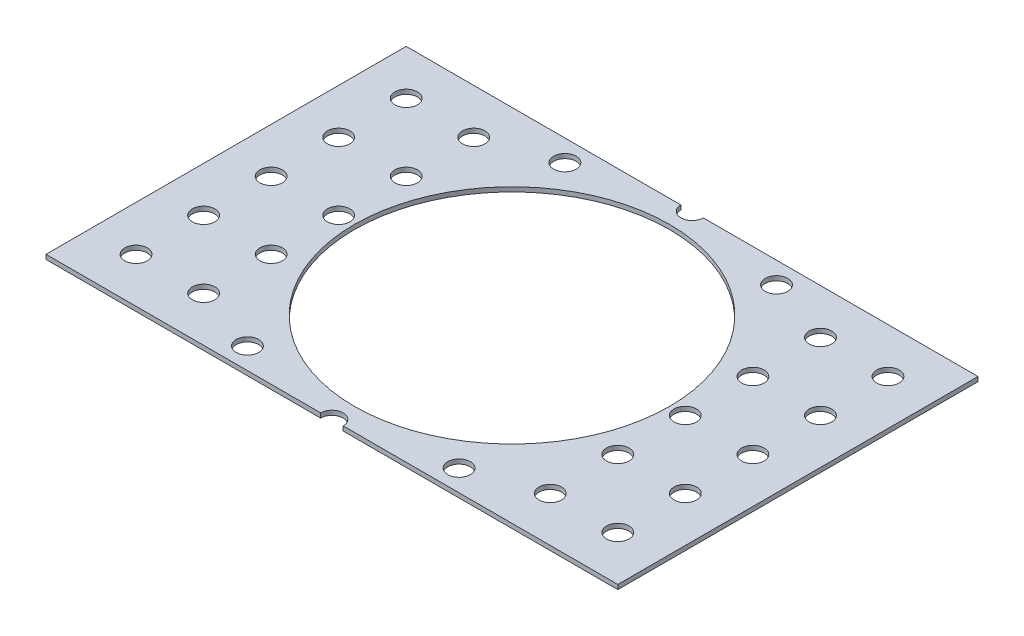
ISO-10303-21;
HEADER;
FILE_DESCRIPTION(('STEP AP214'),'2;1');
FILE_NAME('part.step','',(''),(''),'','','');
FILE_SCHEMA(('AUTOMOTIVE_DESIGN { 1 0 10303 214 1 1 1 1 }'));
ENDSEC;
DATA;
#1=APPLICATION_CONTEXT('core data for automotive mechanical design processes');
#2=APPLICATION_PROTOCOL_DEFINITION('international standard','automotive_design',2000,#1);
#3=PRODUCT_CONTEXT('',#1,'mechanical');
#4=PRODUCT('Part','Part','',(#3));
#5=PRODUCT_RELATED_PRODUCT_CATEGORY('part','',(#4));
#6=PRODUCT_DEFINITION_FORMATION('','',#4);
#7=PRODUCT_DEFINITION_CONTEXT('part definition',#1,'design');
#8=PRODUCT_DEFINITION('design','',#6,#7);
#9=PRODUCT_DEFINITION_SHAPE('','',#8);
#10=(LENGTH_UNIT() NAMED_UNIT(*) SI_UNIT(.MILLI.,.METRE.));
#11=(NAMED_UNIT(*) PLANE_ANGLE_UNIT() SI_UNIT($,.RADIAN.));
#12=(NAMED_UNIT(*) SI_UNIT($,.STERADIAN.) SOLID_ANGLE_UNIT());
#13=UNCERTAINTY_MEASURE_WITH_UNIT(LENGTH_MEASURE(1.E-05),#10,'distance_accuracy_value','');
#14=(GEOMETRIC_REPRESENTATION_CONTEXT(3) GLOBAL_UNCERTAINTY_ASSIGNED_CONTEXT((#13)) GLOBAL_UNIT_ASSIGNED_CONTEXT((#10,
#11,#12)) REPRESENTATION_CONTEXT('',''));
#15=CARTESIAN_POINT('',(0.,0.,0.));
#16=DIRECTION('',(0.,0.,1.));
#17=DIRECTION('',(1.,0.,0.));
#18=AXIS2_PLACEMENT_3D('',#15,#16,#17);
#19=CARTESIAN_POINT('',(-2.5828170556976,1.,55.));
#20=DIRECTION('',(0.,-1.,0.));
#21=DIRECTION('',(0.,0.,-1.));
#22=AXIS2_PLACEMENT_3D('',#19,#20,#21);
#23=PLANE('',#22);
#24=CARTESIAN_POINT('',(35.9171829443024,1.,45.));
#25=DIRECTION('',(0.,1.,0.));
#26=DIRECTION('',(0.,0.,1.));
#27=AXIS2_PLACEMENT_3D('',#24,#25,#26);
#28=CIRCLE('',#27,2.5);
#29=CARTESIAN_POINT('',(35.9171829443024,1.,47.5));
#30=VERTEX_POINT('',#29);
#31=EDGE_CURVE('E314',#30,#30,#28,.T.);
#32=ORIENTED_EDGE('',*,*,#31,.F.);
#33=EDGE_LOOP('',(#32));
#34=FACE_BOUND('',#33,.T.);
#35=CARTESIAN_POINT('',(50.9171829443024,1.,30.));
#36=DIRECTION('',(0.,1.,0.));
#37=DIRECTION('',(0.,0.,1.));
#38=AXIS2_PLACEMENT_3D('',#35,#36,#37);
#39=CIRCLE('',#38,2.49999999999999);
#40=CARTESIAN_POINT('',(50.9171829443024,1.,32.5));
#41=VERTEX_POINT('',#40);
#42=EDGE_CURVE('E302',#41,#41,#39,.T.);
#43=ORIENTED_EDGE('',*,*,#42,.F.);
#44=EDGE_LOOP('',(#43));
#45=FACE_BOUND('',#44,.T.);
#46=CARTESIAN_POINT('',(-56.0828170556976,1.,45.));
#47=DIRECTION('',(0.,1.,0.));
#48=DIRECTION('',(0.,0.,-1.));
#49=AXIS2_PLACEMENT_3D('',#46,#47,#48);
#50=CIRCLE('',#49,2.5);
#51=CARTESIAN_POINT('',(-56.0828170556976,1.,42.5));
#52=VERTEX_POINT('',#51);
#53=EDGE_CURVE('E290',#52,#52,#50,.T.);
#54=ORIENTED_EDGE('',*,*,#53,.F.);
#55=EDGE_LOOP('',(#54));
#56=FACE_BOUND('',#55,.T.);
#57=CARTESIAN_POINT('',(-41.0828170556976,1.,30.));
#58=DIRECTION('',(0.,1.,0.));
#59=DIRECTION('',(0.,0.,-1.));
#60=AXIS2_PLACEMENT_3D('',#57,#58,#59);
#61=CIRCLE('',#60,2.5);
#62=CARTESIAN_POINT('',(-41.0828170556976,1.,27.5));
#63=VERTEX_POINT('',#62);
#64=EDGE_CURVE('E278',#63,#63,#61,.T.);
#65=ORIENTED_EDGE('',*,*,#64,.F.);
#66=EDGE_LOOP('',(#65));
#67=FACE_BOUND('',#66,.T.);
#68=CARTESIAN_POINT('',(-26.0828170556976,1.,50.2528935744086));
#69=DIRECTION('',(0.,1.,0.));
#70=DIRECTION('',(0.,0.,-1.));
#71=AXIS2_PLACEMENT_3D('',#68,#69,#70);
#72=CIRCLE('',#71,2.5);
#73=CARTESIAN_POINT('',(-26.0828170556976,1.,47.7528935744086));
#74=VERTEX_POINT('',#73);
#75=EDGE_CURVE('E266',#74,#74,#72,.T.);
#76=ORIENTED_EDGE('',*,*,#75,.F.);
#77=EDGE_LOOP('',(#76));
#78=FACE_BOUND('',#77,.T.);
#79=CARTESIAN_POINT('',(35.9171829443024,1.,-15.));
#80=DIRECTION('',(0.,1.,0.));
#81=DIRECTION('',(0.,0.,-1.));
#82=AXIS2_PLACEMENT_3D('',#79,#80,#81);
#83=CIRCLE('',#82,2.50000000000002);
#84=CARTESIAN_POINT('',(35.9171829443024,1.,-17.5));
#85=VERTEX_POINT('',#84);
#86=EDGE_CURVE('E254',#85,#85,#83,.T.);
#87=ORIENTED_EDGE('',*,*,#86,.F.);
#88=EDGE_LOOP('',(#87));
#89=FACE_BOUND('',#88,.T.);
#90=CARTESIAN_POINT('',(35.9171829443024,1.,15.));
#91=DIRECTION('',(0.,1.,0.));
#92=DIRECTION('',(0.,0.,-1.));
#93=AXIS2_PLACEMENT_3D('',#90,#91,#92);
#94=CIRCLE('',#93,2.50000000000002);
#95=CARTESIAN_POINT('',(35.9171829443024,1.,12.5));
#96=VERTEX_POINT('',#95);
#97=EDGE_CURVE('E242',#96,#96,#94,.T.);
#98=ORIENTED_EDGE('',*,*,#97,.F.);
#99=EDGE_LOOP('',(#98));
#100=FACE_BOUND('',#99,.T.);
#101=CARTESIAN_POINT('',(50.9171829443024,1.,0.));
#102=DIRECTION('',(0.,1.,0.));
#103=DIRECTION('',(0.,0.,-1.));
#104=AXIS2_PLACEMENT_3D('',#101,#102,#103);
#105=CIRCLE('',#104,2.50000000000002);
#106=CARTESIAN_POINT('',(50.9171829443024,1.,-2.50000000000002));
#107=VERTEX_POINT('',#106);
#108=EDGE_CURVE('E230',#107,#107,#105,.T.);
#109=ORIENTED_EDGE('',*,*,#108,.F.);
#110=EDGE_LOOP('',(#109));
#111=FACE_BOUND('',#110,.T.);
#112=CARTESIAN_POINT('',(-41.0828170556976,1.,15.));
#113=DIRECTION('',(0.,1.,0.));
#114=DIRECTION('',(0.,0.,1.));
#115=AXIS2_PLACEMENT_3D('',#112,#113,#114);
#116=CIRCLE('',#115,2.5);
#117=CARTESIAN_POINT('',(-41.0828170556976,1.,17.5));
#118=VERTEX_POINT('',#117);
#119=EDGE_CURVE('E218',#118,#118,#116,.T.);
#120=ORIENTED_EDGE('',*,*,#119,.F.);
#121=EDGE_LOOP('',(#120));
#122=FACE_BOUND('',#121,.T.);
#123=CARTESIAN_POINT('',(-26.0828170556976,1.,-20.2528935744086));
#124=DIRECTION('',(0.,1.,0.));
#125=DIRECTION('',(0.,0.,1.));
#126=AXIS2_PLACEMENT_3D('',#123,#124,#125);
#127=CIRCLE('',#126,2.5);
#128=CARTESIAN_POINT('',(-26.0828170556976,1.,-17.7528935744086));
#129=VERTEX_POINT('',#128);
#130=EDGE_CURVE('E206',#129,#129,#127,.T.);
#131=ORIENTED_EDGE('',*,*,#130,.F.);
#132=EDGE_LOOP('',(#131));
#133=FACE_BOUND('',#132,.T.);
#134=CARTESIAN_POINT('',(-56.0828170556976,1.,0.));
#135=DIRECTION('',(0.,1.,0.));
#136=DIRECTION('',(0.,0.,1.));
#137=AXIS2_PLACEMENT_3D('',#134,#135,#136);
#138=CIRCLE('',#137,2.5);
#139=CARTESIAN_POINT('',(-56.0828170556976,1.,2.5));
#140=VERTEX_POINT('',#139);
#141=EDGE_CURVE('E194',#140,#140,#138,.T.);
#142=ORIENTED_EDGE('',*,*,#141,.F.);
#143=EDGE_LOOP('',(#142));
#144=FACE_BOUND('',#143,.T.);
#145=CARTESIAN_POINT('',(-56.0828170556976,1.,-15.));
#146=DIRECTION('',(0.,1.,0.));
#147=DIRECTION('',(0.,0.,1.));
#148=AXIS2_PLACEMENT_3D('',#145,#146,#147);
#149=CIRCLE('',#148,2.5);
#150=CARTESIAN_POINT('',(-56.0828170556976,1.,-12.5));
#151=VERTEX_POINT('',#150);
#152=EDGE_CURVE('E182',#151,#151,#149,.T.);
#153=ORIENTED_EDGE('',*,*,#152,.F.);
#154=EDGE_LOOP('',(#153));
#155=FACE_BOUND('',#154,.T.);
#156=DIRECTION('',(0.,0.,1.));
#157=VECTOR('',#156,1.);
#158=CARTESIAN_POINT('',(-66.0828170556976,1.,-25.));
#159=LINE('',#158,#157);
#160=CARTESIAN_POINT('',(-66.0828170556976,1.,-25.));
#161=VERTEX_POINT('',#160);
#162=CARTESIAN_POINT('',(-66.0828170556976,1.,55.));
#163=VERTEX_POINT('',#162);
#164=EDGE_CURVE('E145',#161,#163,#159,.T.);
#165=ORIENTED_EDGE('',*,*,#164,.T.);
#166=DIRECTION('',(1.,0.,0.));
#167=VECTOR('',#166,1.);
#168=CARTESIAN_POINT('',(-66.0828170556976,1.,55.));
#169=LINE('',#168,#167);
#170=CARTESIAN_POINT('',(-5.0828170556976,1.,55.));
#171=VERTEX_POINT('',#170);
#172=EDGE_CURVE('E93',#163,#171,#169,.T.);
#173=ORIENTED_EDGE('',*,*,#172,.T.);
#174=CARTESIAN_POINT('',(-2.5828170556976,1.,55.));
#175=DIRECTION('',(0.,-1.,0.));
#176=DIRECTION('',(0.,0.,-1.));
#177=AXIS2_PLACEMENT_3D('',#174,#175,#176);
#178=CIRCLE('',#177,2.5);
#179=CARTESIAN_POINT('',(-0.0828170556975965,1.,55.));
#180=VERTEX_POINT('',#179);
#181=EDGE_CURVE('E160',#171,#180,#178,.T.);
#182=ORIENTED_EDGE('',*,*,#181,.T.);
#183=DIRECTION('',(1.,0.,0.));
#184=VECTOR('',#183,1.);
#185=CARTESIAN_POINT('',(-0.0828170556975965,1.,55.));
#186=LINE('',#185,#184);
#187=CARTESIAN_POINT('',(60.9171829443024,1.,55.));
#188=VERTEX_POINT('',#187);
#189=EDGE_CURVE('E173',#180,#188,#186,.T.);
#190=ORIENTED_EDGE('',*,*,#189,.T.);
#191=DIRECTION('',(0.,0.,-1.));
#192=VECTOR('',#191,1.);
#193=CARTESIAN_POINT('',(60.9171829443024,1.,-25.));
#194=LINE('',#193,#192);
#195=CARTESIAN_POINT('',(60.9171829443024,1.,-25.));
#196=VERTEX_POINT('',#195);
#197=EDGE_CURVE('E112',#188,#196,#194,.T.);
#198=ORIENTED_EDGE('',*,*,#197,.T.);
#199=DIRECTION('',(-1.,0.,0.));
#200=VECTOR('',#199,1.);
#201=CARTESIAN_POINT('',(-0.082817055697593,1.,-25.));
#202=LINE('',#201,#200);
#203=CARTESIAN_POINT('',(-0.082817055697593,1.,-25.));
#204=VERTEX_POINT('',#203);
#205=EDGE_CURVE('E106',#196,#204,#202,.T.);
#206=ORIENTED_EDGE('',*,*,#205,.T.);
#207=CARTESIAN_POINT('',(-2.5828170556976,1.,-25.0208637163013));
#208=DIRECTION('',(0.,-1.,0.));
#209=DIRECTION('',(0.,0.,1.));
#210=AXIS2_PLACEMENT_3D('',#207,#208,#209);
#211=CIRCLE('',#210,2.50008705741579);
#212=CARTESIAN_POINT('',(-5.08281705569761,1.,-25.));
#213=VERTEX_POINT('',#212);
#214=EDGE_CURVE('E110',#204,#213,#211,.T.);
#215=ORIENTED_EDGE('',*,*,#214,.T.);
#216=DIRECTION('',(-1.,0.,0.));
#217=VECTOR('',#216,1.);
#218=CARTESIAN_POINT('',(-66.0828170556976,1.,-25.));
#219=LINE('',#218,#217);
#220=EDGE_CURVE('E50',#213,#161,#219,.T.);
#221=ORIENTED_EDGE('',*,*,#220,.T.);
#222=EDGE_LOOP('',(#165,#173,#182,#190,#198,#206,#215,#221));
#223=FACE_BOUND('',#222,.T.);
#224=CARTESIAN_POINT('',(-2.5828170556976,1.,15.));
#225=DIRECTION('',(0.,1.,0.));
#226=DIRECTION('',(0.,0.,1.));
#227=AXIS2_PLACEMENT_3D('',#224,#225,#226);
#228=CIRCLE('',#227,35.);
#229=CARTESIAN_POINT('',(-2.5828170556976,1.,50.));
#230=VERTEX_POINT('',#229);
#231=EDGE_CURVE('E134',#230,#230,#228,.T.);
#232=ORIENTED_EDGE('',*,*,#231,.F.);
#233=EDGE_LOOP('',(#232));
#234=FACE_BOUND('',#233,.T.);
#235=CARTESIAN_POINT('',(-41.0828170556976,1.,-15.));
#236=DIRECTION('',(0.,1.,0.));
#237=DIRECTION('',(0.,0.,1.));
#238=AXIS2_PLACEMENT_3D('',#235,#236,#237);
#239=CIRCLE('',#238,2.5);
#240=CARTESIAN_POINT('',(-41.0828170556976,1.,-12.5));
#241=VERTEX_POINT('',#240);
#242=EDGE_CURVE('E188',#241,#241,#239,.T.);
#243=ORIENTED_EDGE('',*,*,#242,.F.);
#244=EDGE_LOOP('',(#243));
#245=FACE_BOUND('',#244,.T.);
#246=CARTESIAN_POINT('',(-41.0828170556976,1.,0.));
#247=DIRECTION('',(0.,1.,0.));
#248=DIRECTION('',(0.,0.,1.));
#249=AXIS2_PLACEMENT_3D('',#246,#247,#248);
#250=CIRCLE('',#249,2.5);
#251=CARTESIAN_POINT('',(-41.0828170556976,1.,2.5));
#252=VERTEX_POINT('',#251);
#253=EDGE_CURVE('E200',#252,#252,#250,.T.);
#254=ORIENTED_EDGE('',*,*,#253,.F.);
#255=EDGE_LOOP('',(#254));
#256=FACE_BOUND('',#255,.T.);
#257=CARTESIAN_POINT('',(-56.0828170556976,1.,15.));
#258=DIRECTION('',(0.,1.,0.));
#259=DIRECTION('',(0.,0.,1.));
#260=AXIS2_PLACEMENT_3D('',#257,#258,#259);
#261=CIRCLE('',#260,2.5);
#262=CARTESIAN_POINT('',(-56.0828170556976,1.,17.5));
#263=VERTEX_POINT('',#262);
#264=EDGE_CURVE('E212',#263,#263,#261,.T.);
#265=ORIENTED_EDGE('',*,*,#264,.F.);
#266=EDGE_LOOP('',(#265));
#267=FACE_BOUND('',#266,.T.);
#268=CARTESIAN_POINT('',(50.9171829443024,1.,-15.));
#269=DIRECTION('',(0.,1.,0.));
#270=DIRECTION('',(0.,0.,-1.));
#271=AXIS2_PLACEMENT_3D('',#268,#269,#270);
#272=CIRCLE('',#271,2.50000000000002);
#273=CARTESIAN_POINT('',(50.9171829443024,1.,-17.5));
#274=VERTEX_POINT('',#273);
#275=EDGE_CURVE('E224',#274,#274,#272,.T.);
#276=ORIENTED_EDGE('',*,*,#275,.F.);
#277=EDGE_LOOP('',(#276));
#278=FACE_BOUND('',#277,.T.);
#279=CARTESIAN_POINT('',(50.9171829443024,1.,15.));
#280=DIRECTION('',(0.,1.,0.));
#281=DIRECTION('',(0.,0.,-1.));
#282=AXIS2_PLACEMENT_3D('',#279,#280,#281);
#283=CIRCLE('',#282,2.50000000000002);
#284=CARTESIAN_POINT('',(50.9171829443024,1.,12.5));
#285=VERTEX_POINT('',#284);
#286=EDGE_CURVE('E236',#285,#285,#283,.T.);
#287=ORIENTED_EDGE('',*,*,#286,.F.);
#288=EDGE_LOOP('',(#287));
#289=FACE_BOUND('',#288,.T.);
#290=CARTESIAN_POINT('',(35.9171829443024,1.,0.));
#291=DIRECTION('',(0.,1.,0.));
#292=DIRECTION('',(0.,0.,-1.));
#293=AXIS2_PLACEMENT_3D('',#290,#291,#292);
#294=CIRCLE('',#293,2.50000000000002);
#295=CARTESIAN_POINT('',(35.9171829443024,1.,-2.50000000000002));
#296=VERTEX_POINT('',#295);
#297=EDGE_CURVE('E248',#296,#296,#294,.T.);
#298=ORIENTED_EDGE('',*,*,#297,.F.);
#299=EDGE_LOOP('',(#298));
#300=FACE_BOUND('',#299,.T.);
#301=CARTESIAN_POINT('',(20.9171829443024,1.,-20.2528935744086));
#302=DIRECTION('',(0.,1.,0.));
#303=DIRECTION('',(0.,0.,-1.));
#304=AXIS2_PLACEMENT_3D('',#301,#302,#303);
#305=CIRCLE('',#304,2.50000000000001);
#306=CARTESIAN_POINT('',(20.9171829443024,1.,-22.7528935744086));
#307=VERTEX_POINT('',#306);
#308=EDGE_CURVE('E260',#307,#307,#305,.T.);
#309=ORIENTED_EDGE('',*,*,#308,.F.);
#310=EDGE_LOOP('',(#309));
#311=FACE_BOUND('',#310,.T.);
#312=CARTESIAN_POINT('',(-41.0828170556976,1.,45.));
#313=DIRECTION('',(0.,1.,0.));
#314=DIRECTION('',(0.,0.,-1.));
#315=AXIS2_PLACEMENT_3D('',#312,#313,#314);
#316=CIRCLE('',#315,2.5);
#317=CARTESIAN_POINT('',(-41.0828170556976,1.,42.5));
#318=VERTEX_POINT('',#317);
#319=EDGE_CURVE('E272',#318,#318,#316,.T.);
#320=ORIENTED_EDGE('',*,*,#319,.F.);
#321=EDGE_LOOP('',(#320));
#322=FACE_BOUND('',#321,.T.);
#323=CARTESIAN_POINT('',(-56.0828170556976,1.,30.));
#324=DIRECTION('',(0.,1.,0.));
#325=DIRECTION('',(0.,0.,-1.));
#326=AXIS2_PLACEMENT_3D('',#323,#324,#325);
#327=CIRCLE('',#326,2.49999999999999);
#328=CARTESIAN_POINT('',(-56.0828170556976,1.,27.5));
#329=VERTEX_POINT('',#328);
#330=EDGE_CURVE('E284',#329,#329,#327,.T.);
#331=ORIENTED_EDGE('',*,*,#330,.F.);
#332=EDGE_LOOP('',(#331));
#333=FACE_BOUND('',#332,.T.);
#334=CARTESIAN_POINT('',(50.9171829443024,1.,45.));
#335=DIRECTION('',(0.,1.,0.));
#336=DIRECTION('',(0.,0.,1.));
#337=AXIS2_PLACEMENT_3D('',#334,#335,#336);
#338=CIRCLE('',#337,2.5);
#339=CARTESIAN_POINT('',(50.9171829443024,1.,47.5));
#340=VERTEX_POINT('',#339);
#341=EDGE_CURVE('E296',#340,#340,#338,.T.);
#342=ORIENTED_EDGE('',*,*,#341,.F.);
#343=EDGE_LOOP('',(#342));
#344=FACE_BOUND('',#343,.T.);
#345=CARTESIAN_POINT('',(35.9171829443024,1.,30.));
#346=DIRECTION('',(0.,1.,0.));
#347=DIRECTION('',(0.,0.,1.));
#348=AXIS2_PLACEMENT_3D('',#345,#346,#347);
#349=CIRCLE('',#348,2.5);
#350=CARTESIAN_POINT('',(35.9171829443024,1.,32.5));
#351=VERTEX_POINT('',#350);
#352=EDGE_CURVE('E308',#351,#351,#349,.T.);
#353=ORIENTED_EDGE('',*,*,#352,.F.);
#354=EDGE_LOOP('',(#353));
#355=FACE_BOUND('',#354,.T.);
#356=CARTESIAN_POINT('',(20.9171829443024,1.,50.2528935744086));
#357=DIRECTION('',(0.,1.,0.));
#358=DIRECTION('',(0.,0.,1.));
#359=AXIS2_PLACEMENT_3D('',#356,#357,#358);
#360=CIRCLE('',#359,2.5);
#361=CARTESIAN_POINT('',(20.9171829443024,1.,52.7528935744086));
#362=VERTEX_POINT('',#361);
#363=EDGE_CURVE('E320',#362,#362,#360,.T.);
#364=ORIENTED_EDGE('',*,*,#363,.F.);
#365=EDGE_LOOP('',(#364));
#366=FACE_BOUND('',#365,.T.);
#367=ADVANCED_FACE('F33',(#34,#45,#56,#67,#78,#89,#100,#111,#122,#133,#144,#155,#223,#234,#245,
#256,#267,#278,#289,#300,#311,#322,#333,#344,#355,#366),#23,.F.);
#368=CARTESIAN_POINT('',(-2.5828170556976,0.,55.));
#369=DIRECTION('',(0.,-1.,0.));
#370=DIRECTION('',(0.,0.,-1.));
#371=AXIS2_PLACEMENT_3D('',#368,#369,#370);
#372=PLANE('',#371);
#373=CARTESIAN_POINT('',(35.9171829443024,0.,45.));
#374=DIRECTION('',(0.,1.,0.));
#375=DIRECTION('',(0.,0.,1.));
#376=AXIS2_PLACEMENT_3D('',#373,#374,#375);
#377=CIRCLE('',#376,2.5);
#378=CARTESIAN_POINT('',(35.9171829443024,0.,47.5));
#379=VERTEX_POINT('',#378);
#380=EDGE_CURVE('E317',#379,#379,#377,.T.);
#381=ORIENTED_EDGE('',*,*,#380,.T.);
#382=EDGE_LOOP('',(#381));
#383=FACE_BOUND('',#382,.T.);
#384=CARTESIAN_POINT('',(50.9171829443024,0.,30.));
#385=DIRECTION('',(0.,1.,0.));
#386=DIRECTION('',(0.,0.,1.));
#387=AXIS2_PLACEMENT_3D('',#384,#385,#386);
#388=CIRCLE('',#387,2.49999999999999);
#389=CARTESIAN_POINT('',(50.9171829443024,0.,32.5));
#390=VERTEX_POINT('',#389);
#391=EDGE_CURVE('E305',#390,#390,#388,.T.);
#392=ORIENTED_EDGE('',*,*,#391,.T.);
#393=EDGE_LOOP('',(#392));
#394=FACE_BOUND('',#393,.T.);
#395=CARTESIAN_POINT('',(-56.0828170556976,0.,45.));
#396=DIRECTION('',(0.,1.,0.));
#397=DIRECTION('',(0.,0.,-1.));
#398=AXIS2_PLACEMENT_3D('',#395,#396,#397);
#399=CIRCLE('',#398,2.5);
#400=CARTESIAN_POINT('',(-56.0828170556976,0.,42.5));
#401=VERTEX_POINT('',#400);
#402=EDGE_CURVE('E293',#401,#401,#399,.T.);
#403=ORIENTED_EDGE('',*,*,#402,.T.);
#404=EDGE_LOOP('',(#403));
#405=FACE_BOUND('',#404,.T.);
#406=CARTESIAN_POINT('',(-41.0828170556976,0.,30.));
#407=DIRECTION('',(0.,1.,0.));
#408=DIRECTION('',(0.,0.,-1.));
#409=AXIS2_PLACEMENT_3D('',#406,#407,#408);
#410=CIRCLE('',#409,2.5);
#411=CARTESIAN_POINT('',(-41.0828170556976,0.,27.5));
#412=VERTEX_POINT('',#411);
#413=EDGE_CURVE('E281',#412,#412,#410,.T.);
#414=ORIENTED_EDGE('',*,*,#413,.T.);
#415=EDGE_LOOP('',(#414));
#416=FACE_BOUND('',#415,.T.);
#417=CARTESIAN_POINT('',(-26.0828170556976,0.,50.2528935744086));
#418=DIRECTION('',(0.,1.,0.));
#419=DIRECTION('',(0.,0.,-1.));
#420=AXIS2_PLACEMENT_3D('',#417,#418,#419);
#421=CIRCLE('',#420,2.5);
#422=CARTESIAN_POINT('',(-26.0828170556976,0.,47.7528935744086));
#423=VERTEX_POINT('',#422);
#424=EDGE_CURVE('E269',#423,#423,#421,.T.);
#425=ORIENTED_EDGE('',*,*,#424,.T.);
#426=EDGE_LOOP('',(#425));
#427=FACE_BOUND('',#426,.T.);
#428=CARTESIAN_POINT('',(35.9171829443024,0.,-15.));
#429=DIRECTION('',(0.,1.,0.));
#430=DIRECTION('',(0.,0.,-1.));
#431=AXIS2_PLACEMENT_3D('',#428,#429,#430);
#432=CIRCLE('',#431,2.50000000000002);
#433=CARTESIAN_POINT('',(35.9171829443024,0.,-17.5));
#434=VERTEX_POINT('',#433);
#435=EDGE_CURVE('E257',#434,#434,#432,.T.);
#436=ORIENTED_EDGE('',*,*,#435,.T.);
#437=EDGE_LOOP('',(#436));
#438=FACE_BOUND('',#437,.T.);
#439=CARTESIAN_POINT('',(35.9171829443024,0.,15.));
#440=DIRECTION('',(0.,1.,0.));
#441=DIRECTION('',(0.,0.,-1.));
#442=AXIS2_PLACEMENT_3D('',#439,#440,#441);
#443=CIRCLE('',#442,2.50000000000002);
#444=CARTESIAN_POINT('',(35.9171829443024,0.,12.5));
#445=VERTEX_POINT('',#444);
#446=EDGE_CURVE('E245',#445,#445,#443,.T.);
#447=ORIENTED_EDGE('',*,*,#446,.T.);
#448=EDGE_LOOP('',(#447));
#449=FACE_BOUND('',#448,.T.);
#450=CARTESIAN_POINT('',(50.9171829443024,0.,0.));
#451=DIRECTION('',(0.,1.,0.));
#452=DIRECTION('',(0.,0.,-1.));
#453=AXIS2_PLACEMENT_3D('',#450,#451,#452);
#454=CIRCLE('',#453,2.50000000000002);
#455=CARTESIAN_POINT('',(50.9171829443024,0.,-2.50000000000002));
#456=VERTEX_POINT('',#455);
#457=EDGE_CURVE('E233',#456,#456,#454,.T.);
#458=ORIENTED_EDGE('',*,*,#457,.T.);
#459=EDGE_LOOP('',(#458));
#460=FACE_BOUND('',#459,.T.);
#461=CARTESIAN_POINT('',(-41.0828170556976,0.,15.));
#462=DIRECTION('',(0.,1.,0.));
#463=DIRECTION('',(0.,0.,1.));
#464=AXIS2_PLACEMENT_3D('',#461,#462,#463);
#465=CIRCLE('',#464,2.5);
#466=CARTESIAN_POINT('',(-41.0828170556976,0.,17.5));
#467=VERTEX_POINT('',#466);
#468=EDGE_CURVE('E221',#467,#467,#465,.T.);
#469=ORIENTED_EDGE('',*,*,#468,.T.);
#470=EDGE_LOOP('',(#469));
#471=FACE_BOUND('',#470,.T.);
#472=CARTESIAN_POINT('',(-26.0828170556976,0.,-20.2528935744086));
#473=DIRECTION('',(0.,1.,0.));
#474=DIRECTION('',(0.,0.,1.));
#475=AXIS2_PLACEMENT_3D('',#472,#473,#474);
#476=CIRCLE('',#475,2.5);
#477=CARTESIAN_POINT('',(-26.0828170556976,0.,-17.7528935744086));
#478=VERTEX_POINT('',#477);
#479=EDGE_CURVE('E209',#478,#478,#476,.T.);
#480=ORIENTED_EDGE('',*,*,#479,.T.);
#481=EDGE_LOOP('',(#480));
#482=FACE_BOUND('',#481,.T.);
#483=CARTESIAN_POINT('',(-56.0828170556976,0.,0.));
#484=DIRECTION('',(0.,1.,0.));
#485=DIRECTION('',(0.,0.,1.));
#486=AXIS2_PLACEMENT_3D('',#483,#484,#485);
#487=CIRCLE('',#486,2.5);
#488=CARTESIAN_POINT('',(-56.0828170556976,0.,2.5));
#489=VERTEX_POINT('',#488);
#490=EDGE_CURVE('E197',#489,#489,#487,.T.);
#491=ORIENTED_EDGE('',*,*,#490,.T.);
#492=EDGE_LOOP('',(#491));
#493=FACE_BOUND('',#492,.T.);
#494=CARTESIAN_POINT('',(-56.0828170556976,0.,-15.));
#495=DIRECTION('',(0.,1.,0.));
#496=DIRECTION('',(0.,0.,1.));
#497=AXIS2_PLACEMENT_3D('',#494,#495,#496);
#498=CIRCLE('',#497,2.5);
#499=CARTESIAN_POINT('',(-56.0828170556976,0.,-12.5));
#500=VERTEX_POINT('',#499);
#501=EDGE_CURVE('E185',#500,#500,#498,.T.);
#502=ORIENTED_EDGE('',*,*,#501,.T.);
#503=EDGE_LOOP('',(#502));
#504=FACE_BOUND('',#503,.T.);
#505=DIRECTION('',(0.,0.,1.));
#506=VECTOR('',#505,1.);
#507=CARTESIAN_POINT('',(-66.0828170556976,0.,-25.));
#508=LINE('',#507,#506);
#509=CARTESIAN_POINT('',(-66.0828170556976,0.,-25.));
#510=VERTEX_POINT('',#509);
#511=CARTESIAN_POINT('',(-66.0828170556976,0.,55.));
#512=VERTEX_POINT('',#511);
#513=EDGE_CURVE('E130',#510,#512,#508,.T.);
#514=ORIENTED_EDGE('',*,*,#513,.F.);
#515=DIRECTION('',(-1.,0.,0.));
#516=VECTOR('',#515,1.);
#517=CARTESIAN_POINT('',(-66.0828170556976,0.,-25.));
#518=LINE('',#517,#516);
#519=CARTESIAN_POINT('',(-5.08281705569761,0.,-25.));
#520=VERTEX_POINT('',#519);
#521=EDGE_CURVE('E85',#520,#510,#518,.T.);
#522=ORIENTED_EDGE('',*,*,#521,.F.);
#523=CARTESIAN_POINT('',(-2.5828170556976,0.,-25.0208637163013));
#524=DIRECTION('',(0.,-1.,0.));
#525=DIRECTION('',(0.,0.,1.));
#526=AXIS2_PLACEMENT_3D('',#523,#524,#525);
#527=CIRCLE('',#526,2.50008705741579);
#528=CARTESIAN_POINT('',(-0.082817055697593,0.,-25.));
#529=VERTEX_POINT('',#528);
#530=EDGE_CURVE('E79',#529,#520,#527,.T.);
#531=ORIENTED_EDGE('',*,*,#530,.F.);
#532=DIRECTION('',(-1.,0.,0.));
#533=VECTOR('',#532,1.);
#534=CARTESIAN_POINT('',(-0.082817055697593,0.,-25.));
#535=LINE('',#534,#533);
#536=CARTESIAN_POINT('',(60.9171829443024,0.,-25.));
#537=VERTEX_POINT('',#536);
#538=EDGE_CURVE('E120',#537,#529,#535,.T.);
#539=ORIENTED_EDGE('',*,*,#538,.F.);
#540=DIRECTION('',(0.,0.,-1.));
#541=VECTOR('',#540,1.);
#542=CARTESIAN_POINT('',(60.9171829443024,0.,-25.));
#543=LINE('',#542,#541);
#544=CARTESIAN_POINT('',(60.9171829443024,0.,55.));
#545=VERTEX_POINT('',#544);
#546=EDGE_CURVE('E140',#545,#537,#543,.T.);
#547=ORIENTED_EDGE('',*,*,#546,.F.);
#548=DIRECTION('',(1.,0.,0.));
#549=VECTOR('',#548,1.);
#550=CARTESIAN_POINT('',(-0.0828170556975965,0.,55.));
#551=LINE('',#550,#549);
#552=CARTESIAN_POINT('',(-0.0828170556975965,0.,55.));
#553=VERTEX_POINT('',#552);
#554=EDGE_CURVE('E138',#553,#545,#551,.T.);
#555=ORIENTED_EDGE('',*,*,#554,.F.);
#556=CARTESIAN_POINT('',(-2.5828170556976,0.,55.));
#557=DIRECTION('',(0.,-1.,0.));
#558=DIRECTION('',(0.,0.,-1.));
#559=AXIS2_PLACEMENT_3D('',#556,#557,#558);
#560=CIRCLE('',#559,2.5);
#561=CARTESIAN_POINT('',(-5.0828170556976,0.,55.));
#562=VERTEX_POINT('',#561);
#563=EDGE_CURVE('E136',#562,#553,#560,.T.);
#564=ORIENTED_EDGE('',*,*,#563,.F.);
#565=DIRECTION('',(1.,0.,0.));
#566=VECTOR('',#565,1.);
#567=CARTESIAN_POINT('',(-66.0828170556976,0.,55.));
#568=LINE('',#567,#566);
#569=EDGE_CURVE('E133',#512,#562,#568,.T.);
#570=ORIENTED_EDGE('',*,*,#569,.F.);
#571=EDGE_LOOP('',(#514,#522,#531,#539,#547,#555,#564,#570));
#572=FACE_BOUND('',#571,.T.);
#573=CARTESIAN_POINT('',(-2.5828170556976,0.,15.));
#574=DIRECTION('',(0.,1.,0.));
#575=DIRECTION('',(0.,0.,1.));
#576=AXIS2_PLACEMENT_3D('',#573,#574,#575);
#577=CIRCLE('',#576,35.);
#578=CARTESIAN_POINT('',(-2.5828170556976,0.,50.));
#579=VERTEX_POINT('',#578);
#580=EDGE_CURVE('E179',#579,#579,#577,.T.);
#581=ORIENTED_EDGE('',*,*,#580,.T.);
#582=EDGE_LOOP('',(#581));
#583=FACE_BOUND('',#582,.T.);
#584=CARTESIAN_POINT('',(-41.0828170556976,0.,-15.));
#585=DIRECTION('',(0.,1.,0.));
#586=DIRECTION('',(0.,0.,1.));
#587=AXIS2_PLACEMENT_3D('',#584,#585,#586);
#588=CIRCLE('',#587,2.5);
#589=CARTESIAN_POINT('',(-41.0828170556976,0.,-12.5));
#590=VERTEX_POINT('',#589);
#591=EDGE_CURVE('E191',#590,#590,#588,.T.);
#592=ORIENTED_EDGE('',*,*,#591,.T.);
#593=EDGE_LOOP('',(#592));
#594=FACE_BOUND('',#593,.T.);
#595=CARTESIAN_POINT('',(-41.0828170556976,0.,0.));
#596=DIRECTION('',(0.,1.,0.));
#597=DIRECTION('',(0.,0.,1.));
#598=AXIS2_PLACEMENT_3D('',#595,#596,#597);
#599=CIRCLE('',#598,2.5);
#600=CARTESIAN_POINT('',(-41.0828170556976,0.,2.5));
#601=VERTEX_POINT('',#600);
#602=EDGE_CURVE('E203',#601,#601,#599,.T.);
#603=ORIENTED_EDGE('',*,*,#602,.T.);
#604=EDGE_LOOP('',(#603));
#605=FACE_BOUND('',#604,.T.);
#606=CARTESIAN_POINT('',(-56.0828170556976,0.,15.));
#607=DIRECTION('',(0.,1.,0.));
#608=DIRECTION('',(0.,0.,1.));
#609=AXIS2_PLACEMENT_3D('',#606,#607,#608);
#610=CIRCLE('',#609,2.5);
#611=CARTESIAN_POINT('',(-56.0828170556976,0.,17.5));
#612=VERTEX_POINT('',#611);
#613=EDGE_CURVE('E215',#612,#612,#610,.T.);
#614=ORIENTED_EDGE('',*,*,#613,.T.);
#615=EDGE_LOOP('',(#614));
#616=FACE_BOUND('',#615,.T.);
#617=CARTESIAN_POINT('',(50.9171829443024,0.,-15.));
#618=DIRECTION('',(0.,1.,0.));
#619=DIRECTION('',(0.,0.,-1.));
#620=AXIS2_PLACEMENT_3D('',#617,#618,#619);
#621=CIRCLE('',#620,2.50000000000002);
#622=CARTESIAN_POINT('',(50.9171829443024,0.,-17.5));
#623=VERTEX_POINT('',#622);
#624=EDGE_CURVE('E227',#623,#623,#621,.T.);
#625=ORIENTED_EDGE('',*,*,#624,.T.);
#626=EDGE_LOOP('',(#625));
#627=FACE_BOUND('',#626,.T.);
#628=CARTESIAN_POINT('',(50.9171829443024,0.,15.));
#629=DIRECTION('',(0.,1.,0.));
#630=DIRECTION('',(0.,0.,-1.));
#631=AXIS2_PLACEMENT_3D('',#628,#629,#630);
#632=CIRCLE('',#631,2.50000000000002);
#633=CARTESIAN_POINT('',(50.9171829443024,0.,12.5));
#634=VERTEX_POINT('',#633);
#635=EDGE_CURVE('E239',#634,#634,#632,.T.);
#636=ORIENTED_EDGE('',*,*,#635,.T.);
#637=EDGE_LOOP('',(#636));
#638=FACE_BOUND('',#637,.T.);
#639=CARTESIAN_POINT('',(35.9171829443024,0.,0.));
#640=DIRECTION('',(0.,1.,0.));
#641=DIRECTION('',(0.,0.,-1.));
#642=AXIS2_PLACEMENT_3D('',#639,#640,#641);
#643=CIRCLE('',#642,2.50000000000002);
#644=CARTESIAN_POINT('',(35.9171829443024,0.,-2.50000000000002));
#645=VERTEX_POINT('',#644);
#646=EDGE_CURVE('E251',#645,#645,#643,.T.);
#647=ORIENTED_EDGE('',*,*,#646,.T.);
#648=EDGE_LOOP('',(#647));
#649=FACE_BOUND('',#648,.T.);
#650=CARTESIAN_POINT('',(20.9171829443024,0.,-20.2528935744086));
#651=DIRECTION('',(0.,1.,0.));
#652=DIRECTION('',(0.,0.,-1.));
#653=AXIS2_PLACEMENT_3D('',#650,#651,#652);
#654=CIRCLE('',#653,2.50000000000001);
#655=CARTESIAN_POINT('',(20.9171829443024,0.,-22.7528935744086));
#656=VERTEX_POINT('',#655);
#657=EDGE_CURVE('E263',#656,#656,#654,.T.);
#658=ORIENTED_EDGE('',*,*,#657,.T.);
#659=EDGE_LOOP('',(#658));
#660=FACE_BOUND('',#659,.T.);
#661=CARTESIAN_POINT('',(-41.0828170556976,0.,45.));
#662=DIRECTION('',(0.,1.,0.));
#663=DIRECTION('',(0.,0.,-1.));
#664=AXIS2_PLACEMENT_3D('',#661,#662,#663);
#665=CIRCLE('',#664,2.5);
#666=CARTESIAN_POINT('',(-41.0828170556976,0.,42.5));
#667=VERTEX_POINT('',#666);
#668=EDGE_CURVE('E275',#667,#667,#665,.T.);
#669=ORIENTED_EDGE('',*,*,#668,.T.);
#670=EDGE_LOOP('',(#669));
#671=FACE_BOUND('',#670,.T.);
#672=CARTESIAN_POINT('',(-56.0828170556976,0.,30.));
#673=DIRECTION('',(0.,1.,0.));
#674=DIRECTION('',(0.,0.,-1.));
#675=AXIS2_PLACEMENT_3D('',#672,#673,#674);
#676=CIRCLE('',#675,2.49999999999999);
#677=CARTESIAN_POINT('',(-56.0828170556976,0.,27.5));
#678=VERTEX_POINT('',#677);
#679=EDGE_CURVE('E287',#678,#678,#676,.T.);
#680=ORIENTED_EDGE('',*,*,#679,.T.);
#681=EDGE_LOOP('',(#680));
#682=FACE_BOUND('',#681,.T.);
#683=CARTESIAN_POINT('',(50.9171829443024,0.,45.));
#684=DIRECTION('',(0.,1.,0.));
#685=DIRECTION('',(0.,0.,1.));
#686=AXIS2_PLACEMENT_3D('',#683,#684,#685);
#687=CIRCLE('',#686,2.5);
#688=CARTESIAN_POINT('',(50.9171829443024,0.,47.5));
#689=VERTEX_POINT('',#688);
#690=EDGE_CURVE('E299',#689,#689,#687,.T.);
#691=ORIENTED_EDGE('',*,*,#690,.T.);
#692=EDGE_LOOP('',(#691));
#693=FACE_BOUND('',#692,.T.);
#694=CARTESIAN_POINT('',(35.9171829443024,0.,30.));
#695=DIRECTION('',(0.,1.,0.));
#696=DIRECTION('',(0.,0.,1.));
#697=AXIS2_PLACEMENT_3D('',#694,#695,#696);
#698=CIRCLE('',#697,2.5);
#699=CARTESIAN_POINT('',(35.9171829443024,0.,32.5));
#700=VERTEX_POINT('',#699);
#701=EDGE_CURVE('E311',#700,#700,#698,.T.);
#702=ORIENTED_EDGE('',*,*,#701,.T.);
#703=EDGE_LOOP('',(#702));
#704=FACE_BOUND('',#703,.T.);
#705=CARTESIAN_POINT('',(20.9171829443024,0.,50.2528935744086));
#706=DIRECTION('',(0.,1.,0.));
#707=DIRECTION('',(0.,0.,1.));
#708=AXIS2_PLACEMENT_3D('',#705,#706,#707);
#709=CIRCLE('',#708,2.5);
#710=CARTESIAN_POINT('',(20.9171829443024,0.,52.7528935744086));
#711=VERTEX_POINT('',#710);
#712=EDGE_CURVE('E323',#711,#711,#709,.T.);
#713=ORIENTED_EDGE('',*,*,#712,.T.);
#714=EDGE_LOOP('',(#713));
#715=FACE_BOUND('',#714,.T.);
#716=ADVANCED_FACE('F164',(#383,#394,#405,#416,#427,#438,#449,#460,#471,#482,#493,#504,#572,
#583,#594,#605,#616,#627,#638,#649,#660,#671,#682,#693,#704,#715),#372,.T.);
#717=CARTESIAN_POINT('',(-66.0828170556976,1.,-25.));
#718=DIRECTION('',(1.,0.,0.));
#719=DIRECTION('',(0.,0.,-1.));
#720=AXIS2_PLACEMENT_3D('',#717,#718,#719);
#721=PLANE('',#720);
#722=ORIENTED_EDGE('',*,*,#513,.T.);
#723=DIRECTION('',(0.,-1.,0.));
#724=VECTOR('',#723,1.);
#725=CARTESIAN_POINT('',(-66.0828170556976,1.,55.));
#726=LINE('',#725,#724);
#727=EDGE_CURVE('E11',#163,#512,#726,.T.);
#728=ORIENTED_EDGE('',*,*,#727,.F.);
#729=ORIENTED_EDGE('',*,*,#164,.F.);
#730=DIRECTION('',(0.,-1.,0.));
#731=VECTOR('',#730,1.);
#732=CARTESIAN_POINT('',(-66.0828170556976,1.,-25.));
#733=LINE('',#732,#731);
#734=EDGE_CURVE('E126',#161,#510,#733,.T.);
#735=ORIENTED_EDGE('',*,*,#734,.T.);
#736=EDGE_LOOP('',(#722,#728,#729,#735));
#737=FACE_BOUND('',#736,.T.);
#738=ADVANCED_FACE('F35',(#737),#721,.F.);
#739=CARTESIAN_POINT('',(-66.0828170556976,1.,55.));
#740=DIRECTION('',(0.,0.,-1.));
#741=DIRECTION('',(-1.,0.,0.));
#742=AXIS2_PLACEMENT_3D('',#739,#740,#741);
#743=PLANE('',#742);
#744=ORIENTED_EDGE('',*,*,#569,.T.);
#745=DIRECTION('',(0.,-1.,0.));
#746=VECTOR('',#745,1.);
#747=CARTESIAN_POINT('',(-5.0828170556976,1.,55.));
#748=LINE('',#747,#746);
#749=EDGE_CURVE('E42',#171,#562,#748,.T.);
#750=ORIENTED_EDGE('',*,*,#749,.F.);
#751=ORIENTED_EDGE('',*,*,#172,.F.);
#752=ORIENTED_EDGE('',*,*,#727,.T.);
#753=EDGE_LOOP('',(#744,#750,#751,#752));
#754=FACE_BOUND('',#753,.T.);
#755=ADVANCED_FACE('F358',(#754),#743,.F.);
#756=CARTESIAN_POINT('',(-2.5828170556976,1.,55.));
#757=DIRECTION('',(0.,-1.,0.));
#758=DIRECTION('',(0.,0.,-1.));
#759=AXIS2_PLACEMENT_3D('',#756,#757,#758);
#760=CYLINDRICAL_SURFACE('',#759,2.5);
#761=ORIENTED_EDGE('',*,*,#563,.T.);
#762=DIRECTION('',(0.,-1.,0.));
#763=VECTOR('',#762,1.);
#764=CARTESIAN_POINT('',(-0.0828170556975965,1.,55.));
#765=LINE('',#764,#763);
#766=EDGE_CURVE('E152',#180,#553,#765,.T.);
#767=ORIENTED_EDGE('',*,*,#766,.F.);
#768=ORIENTED_EDGE('',*,*,#181,.F.);
#769=ORIENTED_EDGE('',*,*,#749,.T.);
#770=EDGE_LOOP('',(#761,#767,#768,#769));
#771=FACE_BOUND('',#770,.T.);
#772=ADVANCED_FACE('F158',(#771),#760,.F.);
#773=CARTESIAN_POINT('',(-0.0828170556975965,1.,55.));
#774=DIRECTION('',(0.,0.,-1.));
#775=DIRECTION('',(-1.,0.,0.));
#776=AXIS2_PLACEMENT_3D('',#773,#774,#775);
#777=PLANE('',#776);
#778=ORIENTED_EDGE('',*,*,#554,.T.);
#779=DIRECTION('',(0.,-1.,0.));
#780=VECTOR('',#779,1.);
#781=CARTESIAN_POINT('',(60.9171829443024,1.,55.));
#782=LINE('',#781,#780);
#783=EDGE_CURVE('E149',#188,#545,#782,.T.);
#784=ORIENTED_EDGE('',*,*,#783,.F.);
#785=ORIENTED_EDGE('',*,*,#189,.F.);
#786=ORIENTED_EDGE('',*,*,#766,.T.);
#787=EDGE_LOOP('',(#778,#784,#785,#786));
#788=FACE_BOUND('',#787,.T.);
#789=ADVANCED_FACE('F169',(#788),#777,.F.);
#790=CARTESIAN_POINT('',(60.9171829443024,1.,-25.));
#791=DIRECTION('',(-1.,0.,0.));
#792=DIRECTION('',(0.,0.,1.));
#793=AXIS2_PLACEMENT_3D('',#790,#791,#792);
#794=PLANE('',#793);
#795=ORIENTED_EDGE('',*,*,#546,.T.);
#796=DIRECTION('',(0.,-1.,0.));
#797=VECTOR('',#796,1.);
#798=CARTESIAN_POINT('',(60.9171829443024,1.,-25.));
#799=LINE('',#798,#797);
#800=EDGE_CURVE('E121',#196,#537,#799,.T.);
#801=ORIENTED_EDGE('',*,*,#800,.F.);
#802=ORIENTED_EDGE('',*,*,#197,.F.);
#803=ORIENTED_EDGE('',*,*,#783,.T.);
#804=EDGE_LOOP('',(#795,#801,#802,#803));
#805=FACE_BOUND('',#804,.T.);
#806=ADVANCED_FACE('F172',(#805),#794,.F.);
#807=CARTESIAN_POINT('',(-0.082817055697593,1.,-25.));
#808=DIRECTION('',(0.,0.,1.));
#809=DIRECTION('',(1.,0.,0.));
#810=AXIS2_PLACEMENT_3D('',#807,#808,#809);
#811=PLANE('',#810);
#812=ORIENTED_EDGE('',*,*,#538,.T.);
#813=DIRECTION('',(0.,-1.,0.));
#814=VECTOR('',#813,1.);
#815=CARTESIAN_POINT('',(-0.082817055697593,1.,-25.));
#816=LINE('',#815,#814);
#817=EDGE_CURVE('E117',#204,#529,#816,.T.);
#818=ORIENTED_EDGE('',*,*,#817,.F.);
#819=ORIENTED_EDGE('',*,*,#205,.F.);
#820=ORIENTED_EDGE('',*,*,#800,.T.);
#821=EDGE_LOOP('',(#812,#818,#819,#820));
#822=FACE_BOUND('',#821,.T.);
#823=ADVANCED_FACE('F118',(#822),#811,.F.);
#824=CARTESIAN_POINT('',(-2.5828170556976,1.,-25.0208637163013));
#825=DIRECTION('',(0.,-1.,0.));
#826=DIRECTION('',(0.,0.,-1.));
#827=AXIS2_PLACEMENT_3D('',#824,#825,#826);
#828=CYLINDRICAL_SURFACE('',#827,2.50008705741579);
#829=ORIENTED_EDGE('',*,*,#530,.T.);
#830=DIRECTION('',(0.,-1.,0.));
#831=VECTOR('',#830,1.);
#832=CARTESIAN_POINT('',(-5.08281705569761,1.,-25.));
#833=LINE('',#832,#831);
#834=EDGE_CURVE('E122',#213,#520,#833,.T.);
#835=ORIENTED_EDGE('',*,*,#834,.F.);
#836=ORIENTED_EDGE('',*,*,#214,.F.);
#837=ORIENTED_EDGE('',*,*,#817,.T.);
#838=EDGE_LOOP('',(#829,#835,#836,#837));
#839=FACE_BOUND('',#838,.T.);
#840=ADVANCED_FACE('F124',(#839),#828,.F.);
#841=CARTESIAN_POINT('',(-66.0828170556976,1.,-25.));
#842=DIRECTION('',(0.,0.,1.));
#843=DIRECTION('',(1.,0.,0.));
#844=AXIS2_PLACEMENT_3D('',#841,#842,#843);
#845=PLANE('',#844);
#846=ORIENTED_EDGE('',*,*,#521,.T.);
#847=ORIENTED_EDGE('',*,*,#734,.F.);
#848=ORIENTED_EDGE('',*,*,#220,.F.);
#849=ORIENTED_EDGE('',*,*,#834,.T.);
#850=EDGE_LOOP('',(#846,#847,#848,#849));
#851=FACE_BOUND('',#850,.T.);
#852=ADVANCED_FACE('F346',(#851),#845,.F.);
#853=CARTESIAN_POINT('',(-2.5828170556976,1.,15.));
#854=DIRECTION('',(0.,-1.,0.));
#855=DIRECTION('',(0.,0.,-1.));
#856=AXIS2_PLACEMENT_3D('',#853,#854,#855);
#857=CYLINDRICAL_SURFACE('',#856,35.);
#858=ORIENTED_EDGE('',*,*,#231,.T.);
#859=EDGE_LOOP('',(#858));
#860=FACE_BOUND('',#859,.T.);
#861=ORIENTED_EDGE('',*,*,#580,.F.);
#862=EDGE_LOOP('',(#861));
#863=FACE_BOUND('',#862,.T.);
#864=ADVANCED_FACE('F343',(#860,#863),#857,.F.);
#865=CARTESIAN_POINT('',(-56.0828170556976,1.,-15.));
#866=DIRECTION('',(0.,-1.,0.));
#867=DIRECTION('',(0.,0.,-1.));
#868=AXIS2_PLACEMENT_3D('',#865,#866,#867);
#869=CYLINDRICAL_SURFACE('',#868,2.5);
#870=ORIENTED_EDGE('',*,*,#152,.T.);
#871=EDGE_LOOP('',(#870));
#872=FACE_BOUND('',#871,.T.);
#873=ORIENTED_EDGE('',*,*,#501,.F.);
#874=EDGE_LOOP('',(#873));
#875=FACE_BOUND('',#874,.T.);
#876=ADVANCED_FACE('F422',(#872,#875),#869,.F.);
#877=CARTESIAN_POINT('',(-41.0828170556976,1.,-15.));
#878=DIRECTION('',(0.,-1.,0.));
#879=DIRECTION('',(0.,0.,-1.));
#880=AXIS2_PLACEMENT_3D('',#877,#878,#879);
#881=CYLINDRICAL_SURFACE('',#880,2.5);
#882=ORIENTED_EDGE('',*,*,#242,.T.);
#883=EDGE_LOOP('',(#882));
#884=FACE_BOUND('',#883,.T.);
#885=ORIENTED_EDGE('',*,*,#591,.F.);
#886=EDGE_LOOP('',(#885));
#887=FACE_BOUND('',#886,.T.);
#888=ADVANCED_FACE('F430',(#884,#887),#881,.F.);
#889=CARTESIAN_POINT('',(-56.0828170556976,1.,0.));
#890=DIRECTION('',(0.,-1.,0.));
#891=DIRECTION('',(0.,0.,-1.));
#892=AXIS2_PLACEMENT_3D('',#889,#890,#891);
#893=CYLINDRICAL_SURFACE('',#892,2.5);
#894=ORIENTED_EDGE('',*,*,#141,.T.);
#895=EDGE_LOOP('',(#894));
#896=FACE_BOUND('',#895,.T.);
#897=ORIENTED_EDGE('',*,*,#490,.F.);
#898=EDGE_LOOP('',(#897));
#899=FACE_BOUND('',#898,.T.);
#900=ADVANCED_FACE('F438',(#896,#899),#893,.F.);
#901=CARTESIAN_POINT('',(-41.0828170556976,1.,0.));
#902=DIRECTION('',(0.,-1.,0.));
#903=DIRECTION('',(0.,0.,-1.));
#904=AXIS2_PLACEMENT_3D('',#901,#902,#903);
#905=CYLINDRICAL_SURFACE('',#904,2.5);
#906=ORIENTED_EDGE('',*,*,#253,.T.);
#907=EDGE_LOOP('',(#906));
#908=FACE_BOUND('',#907,.T.);
#909=ORIENTED_EDGE('',*,*,#602,.F.);
#910=EDGE_LOOP('',(#909));
#911=FACE_BOUND('',#910,.T.);
#912=ADVANCED_FACE('F447',(#908,#911),#905,.F.);
#913=CARTESIAN_POINT('',(-26.0828170556976,1.,-20.2528935744086));
#914=DIRECTION('',(0.,-1.,0.));
#915=DIRECTION('',(0.,0.,-1.));
#916=AXIS2_PLACEMENT_3D('',#913,#914,#915);
#917=CYLINDRICAL_SURFACE('',#916,2.5);
#918=ORIENTED_EDGE('',*,*,#130,.T.);
#919=EDGE_LOOP('',(#918));
#920=FACE_BOUND('',#919,.T.);
#921=ORIENTED_EDGE('',*,*,#479,.F.);
#922=EDGE_LOOP('',(#921));
#923=FACE_BOUND('',#922,.T.);
#924=ADVANCED_FACE('F456',(#920,#923),#917,.F.);
#925=CARTESIAN_POINT('',(-56.0828170556976,1.,15.));
#926=DIRECTION('',(0.,-1.,0.));
#927=DIRECTION('',(0.,0.,-1.));
#928=AXIS2_PLACEMENT_3D('',#925,#926,#927);
#929=CYLINDRICAL_SURFACE('',#928,2.5);
#930=ORIENTED_EDGE('',*,*,#264,.T.);
#931=EDGE_LOOP('',(#930));
#932=FACE_BOUND('',#931,.T.);
#933=ORIENTED_EDGE('',*,*,#613,.F.);
#934=EDGE_LOOP('',(#933));
#935=FACE_BOUND('',#934,.T.);
#936=ADVANCED_FACE('F465',(#932,#935),#929,.F.);
#937=CARTESIAN_POINT('',(-41.0828170556976,1.,15.));
#938=DIRECTION('',(0.,-1.,0.));
#939=DIRECTION('',(0.,0.,-1.));
#940=AXIS2_PLACEMENT_3D('',#937,#938,#939);
#941=CYLINDRICAL_SURFACE('',#940,2.5);
#942=ORIENTED_EDGE('',*,*,#119,.T.);
#943=EDGE_LOOP('',(#942));
#944=FACE_BOUND('',#943,.T.);
#945=ORIENTED_EDGE('',*,*,#468,.F.);
#946=EDGE_LOOP('',(#945));
#947=FACE_BOUND('',#946,.T.);
#948=ADVANCED_FACE('F474',(#944,#947),#941,.F.);
#949=CARTESIAN_POINT('',(50.9171829443024,1.,-15.));
#950=DIRECTION('',(0.,-1.,0.));
#951=DIRECTION('',(0.,0.,-1.));
#952=AXIS2_PLACEMENT_3D('',#949,#950,#951);
#953=CYLINDRICAL_SURFACE('',#952,2.50000000000002);
#954=ORIENTED_EDGE('',*,*,#275,.T.);
#955=EDGE_LOOP('',(#954));
#956=FACE_BOUND('',#955,.T.);
#957=ORIENTED_EDGE('',*,*,#624,.F.);
#958=EDGE_LOOP('',(#957));
#959=FACE_BOUND('',#958,.T.);
#960=ADVANCED_FACE('F483',(#956,#959),#953,.F.);
#961=CARTESIAN_POINT('',(50.9171829443024,1.,0.));
#962=DIRECTION('',(0.,-1.,0.));
#963=DIRECTION('',(0.,0.,-1.));
#964=AXIS2_PLACEMENT_3D('',#961,#962,#963);
#965=CYLINDRICAL_SURFACE('',#964,2.50000000000002);
#966=ORIENTED_EDGE('',*,*,#108,.T.);
#967=EDGE_LOOP('',(#966));
#968=FACE_BOUND('',#967,.T.);
#969=ORIENTED_EDGE('',*,*,#457,.F.);
#970=EDGE_LOOP('',(#969));
#971=FACE_BOUND('',#970,.T.);
#972=ADVANCED_FACE('F492',(#968,#971),#965,.F.);
#973=CARTESIAN_POINT('',(50.9171829443024,1.,15.));
#974=DIRECTION('',(0.,-1.,0.));
#975=DIRECTION('',(0.,0.,-1.));
#976=AXIS2_PLACEMENT_3D('',#973,#974,#975);
#977=CYLINDRICAL_SURFACE('',#976,2.50000000000002);
#978=ORIENTED_EDGE('',*,*,#286,.T.);
#979=EDGE_LOOP('',(#978));
#980=FACE_BOUND('',#979,.T.);
#981=ORIENTED_EDGE('',*,*,#635,.F.);
#982=EDGE_LOOP('',(#981));
#983=FACE_BOUND('',#982,.T.);
#984=ADVANCED_FACE('F501',(#980,#983),#977,.F.);
#985=CARTESIAN_POINT('',(35.9171829443024,1.,15.));
#986=DIRECTION('',(0.,-1.,0.));
#987=DIRECTION('',(0.,0.,-1.));
#988=AXIS2_PLACEMENT_3D('',#985,#986,#987);
#989=CYLINDRICAL_SURFACE('',#988,2.50000000000002);
#990=ORIENTED_EDGE('',*,*,#97,.T.);
#991=EDGE_LOOP('',(#990));
#992=FACE_BOUND('',#991,.T.);
#993=ORIENTED_EDGE('',*,*,#446,.F.);
#994=EDGE_LOOP('',(#993));
#995=FACE_BOUND('',#994,.T.);
#996=ADVANCED_FACE('F510',(#992,#995),#989,.F.);
#997=CARTESIAN_POINT('',(35.9171829443024,1.,0.));
#998=DIRECTION('',(0.,-1.,0.));
#999=DIRECTION('',(0.,0.,-1.));
#1000=AXIS2_PLACEMENT_3D('',#997,#998,#999);
#1001=CYLINDRICAL_SURFACE('',#1000,2.50000000000002);
#1002=ORIENTED_EDGE('',*,*,#297,.T.);
#1003=EDGE_LOOP('',(#1002));
#1004=FACE_BOUND('',#1003,.T.);
#1005=ORIENTED_EDGE('',*,*,#646,.F.);
#1006=EDGE_LOOP('',(#1005));
#1007=FACE_BOUND('',#1006,.T.);
#1008=ADVANCED_FACE('F519',(#1004,#1007),#1001,.F.);
#1009=CARTESIAN_POINT('',(35.9171829443024,1.,-15.));
#1010=DIRECTION('',(0.,-1.,0.));
#1011=DIRECTION('',(0.,0.,-1.));
#1012=AXIS2_PLACEMENT_3D('',#1009,#1010,#1011);
#1013=CYLINDRICAL_SURFACE('',#1012,2.50000000000002);
#1014=ORIENTED_EDGE('',*,*,#86,.T.);
#1015=EDGE_LOOP('',(#1014));
#1016=FACE_BOUND('',#1015,.T.);
#1017=ORIENTED_EDGE('',*,*,#435,.F.);
#1018=EDGE_LOOP('',(#1017));
#1019=FACE_BOUND('',#1018,.T.);
#1020=ADVANCED_FACE('F528',(#1016,#1019),#1013,.F.);
#1021=CARTESIAN_POINT('',(20.9171829443024,1.,-20.2528935744086));
#1022=DIRECTION('',(0.,-1.,0.));
#1023=DIRECTION('',(0.,0.,-1.));
#1024=AXIS2_PLACEMENT_3D('',#1021,#1022,#1023);
#1025=CYLINDRICAL_SURFACE('',#1024,2.50000000000001);
#1026=ORIENTED_EDGE('',*,*,#308,.T.);
#1027=EDGE_LOOP('',(#1026));
#1028=FACE_BOUND('',#1027,.T.);
#1029=ORIENTED_EDGE('',*,*,#657,.F.);
#1030=EDGE_LOOP('',(#1029));
#1031=FACE_BOUND('',#1030,.T.);
#1032=ADVANCED_FACE('F537',(#1028,#1031),#1025,.F.);
#1033=CARTESIAN_POINT('',(-26.0828170556976,1.,50.2528935744086));
#1034=DIRECTION('',(0.,-1.,0.));
#1035=DIRECTION('',(0.,0.,-1.));
#1036=AXIS2_PLACEMENT_3D('',#1033,#1034,#1035);
#1037=CYLINDRICAL_SURFACE('',#1036,2.5);
#1038=ORIENTED_EDGE('',*,*,#75,.T.);
#1039=EDGE_LOOP('',(#1038));
#1040=FACE_BOUND('',#1039,.T.);
#1041=ORIENTED_EDGE('',*,*,#424,.F.);
#1042=EDGE_LOOP('',(#1041));
#1043=FACE_BOUND('',#1042,.T.);
#1044=ADVANCED_FACE('F546',(#1040,#1043),#1037,.F.);
#1045=CARTESIAN_POINT('',(-41.0828170556976,1.,45.));
#1046=DIRECTION('',(0.,-1.,0.));
#1047=DIRECTION('',(0.,0.,-1.));
#1048=AXIS2_PLACEMENT_3D('',#1045,#1046,#1047);
#1049=CYLINDRICAL_SURFACE('',#1048,2.5);
#1050=ORIENTED_EDGE('',*,*,#319,.T.);
#1051=EDGE_LOOP('',(#1050));
#1052=FACE_BOUND('',#1051,.T.);
#1053=ORIENTED_EDGE('',*,*,#668,.F.);
#1054=EDGE_LOOP('',(#1053));
#1055=FACE_BOUND('',#1054,.T.);
#1056=ADVANCED_FACE('F555',(#1052,#1055),#1049,.F.);
#1057=CARTESIAN_POINT('',(-41.0828170556976,1.,30.));
#1058=DIRECTION('',(0.,-1.,0.));
#1059=DIRECTION('',(0.,0.,-1.));
#1060=AXIS2_PLACEMENT_3D('',#1057,#1058,#1059);
#1061=CYLINDRICAL_SURFACE('',#1060,2.5);
#1062=ORIENTED_EDGE('',*,*,#64,.T.);
#1063=EDGE_LOOP('',(#1062));
#1064=FACE_BOUND('',#1063,.T.);
#1065=ORIENTED_EDGE('',*,*,#413,.F.);
#1066=EDGE_LOOP('',(#1065));
#1067=FACE_BOUND('',#1066,.T.);
#1068=ADVANCED_FACE('F564',(#1064,#1067),#1061,.F.);
#1069=CARTESIAN_POINT('',(-56.0828170556976,1.,30.));
#1070=DIRECTION('',(0.,-1.,0.));
#1071=DIRECTION('',(0.,0.,-1.));
#1072=AXIS2_PLACEMENT_3D('',#1069,#1070,#1071);
#1073=CYLINDRICAL_SURFACE('',#1072,2.49999999999999);
#1074=ORIENTED_EDGE('',*,*,#330,.T.);
#1075=EDGE_LOOP('',(#1074));
#1076=FACE_BOUND('',#1075,.T.);
#1077=ORIENTED_EDGE('',*,*,#679,.F.);
#1078=EDGE_LOOP('',(#1077));
#1079=FACE_BOUND('',#1078,.T.);
#1080=ADVANCED_FACE('F573',(#1076,#1079),#1073,.F.);
#1081=CARTESIAN_POINT('',(-56.0828170556976,1.,45.));
#1082=DIRECTION('',(0.,-1.,0.));
#1083=DIRECTION('',(0.,0.,-1.));
#1084=AXIS2_PLACEMENT_3D('',#1081,#1082,#1083);
#1085=CYLINDRICAL_SURFACE('',#1084,2.5);
#1086=ORIENTED_EDGE('',*,*,#53,.T.);
#1087=EDGE_LOOP('',(#1086));
#1088=FACE_BOUND('',#1087,.T.);
#1089=ORIENTED_EDGE('',*,*,#402,.F.);
#1090=EDGE_LOOP('',(#1089));
#1091=FACE_BOUND('',#1090,.T.);
#1092=ADVANCED_FACE('F582',(#1088,#1091),#1085,.F.);
#1093=CARTESIAN_POINT('',(50.9171829443024,1.,45.));
#1094=DIRECTION('',(0.,-1.,0.));
#1095=DIRECTION('',(0.,0.,-1.));
#1096=AXIS2_PLACEMENT_3D('',#1093,#1094,#1095);
#1097=CYLINDRICAL_SURFACE('',#1096,2.5);
#1098=ORIENTED_EDGE('',*,*,#341,.T.);
#1099=EDGE_LOOP('',(#1098));
#1100=FACE_BOUND('',#1099,.T.);
#1101=ORIENTED_EDGE('',*,*,#690,.F.);
#1102=EDGE_LOOP('',(#1101));
#1103=FACE_BOUND('',#1102,.T.);
#1104=ADVANCED_FACE('F591',(#1100,#1103),#1097,.F.);
#1105=CARTESIAN_POINT('',(50.9171829443024,1.,30.));
#1106=DIRECTION('',(0.,-1.,0.));
#1107=DIRECTION('',(0.,0.,-1.));
#1108=AXIS2_PLACEMENT_3D('',#1105,#1106,#1107);
#1109=CYLINDRICAL_SURFACE('',#1108,2.49999999999999);
#1110=ORIENTED_EDGE('',*,*,#42,.T.);
#1111=EDGE_LOOP('',(#1110));
#1112=FACE_BOUND('',#1111,.T.);
#1113=ORIENTED_EDGE('',*,*,#391,.F.);
#1114=EDGE_LOOP('',(#1113));
#1115=FACE_BOUND('',#1114,.T.);
#1116=ADVANCED_FACE('F600',(#1112,#1115),#1109,.F.);
#1117=CARTESIAN_POINT('',(35.9171829443024,1.,30.));
#1118=DIRECTION('',(0.,-1.,0.));
#1119=DIRECTION('',(0.,0.,-1.));
#1120=AXIS2_PLACEMENT_3D('',#1117,#1118,#1119);
#1121=CYLINDRICAL_SURFACE('',#1120,2.5);
#1122=ORIENTED_EDGE('',*,*,#352,.T.);
#1123=EDGE_LOOP('',(#1122));
#1124=FACE_BOUND('',#1123,.T.);
#1125=ORIENTED_EDGE('',*,*,#701,.F.);
#1126=EDGE_LOOP('',(#1125));
#1127=FACE_BOUND('',#1126,.T.);
#1128=ADVANCED_FACE('F609',(#1124,#1127),#1121,.F.);
#1129=CARTESIAN_POINT('',(35.9171829443024,1.,45.));
#1130=DIRECTION('',(0.,-1.,0.));
#1131=DIRECTION('',(0.,0.,-1.));
#1132=AXIS2_PLACEMENT_3D('',#1129,#1130,#1131);
#1133=CYLINDRICAL_SURFACE('',#1132,2.5);
#1134=ORIENTED_EDGE('',*,*,#31,.T.);
#1135=EDGE_LOOP('',(#1134));
#1136=FACE_BOUND('',#1135,.T.);
#1137=ORIENTED_EDGE('',*,*,#380,.F.);
#1138=EDGE_LOOP('',(#1137));
#1139=FACE_BOUND('',#1138,.T.);
#1140=ADVANCED_FACE('F618',(#1136,#1139),#1133,.F.);
#1141=CARTESIAN_POINT('',(20.9171829443024,1.,50.2528935744086));
#1142=DIRECTION('',(0.,-1.,0.));
#1143=DIRECTION('',(0.,0.,-1.));
#1144=AXIS2_PLACEMENT_3D('',#1141,#1142,#1143);
#1145=CYLINDRICAL_SURFACE('',#1144,2.5);
#1146=ORIENTED_EDGE('',*,*,#363,.T.);
#1147=EDGE_LOOP('',(#1146));
#1148=FACE_BOUND('',#1147,.T.);
#1149=ORIENTED_EDGE('',*,*,#712,.F.);
#1150=EDGE_LOOP('',(#1149));
#1151=FACE_BOUND('',#1150,.T.);
#1152=ADVANCED_FACE('F329',(#1148,#1151),#1145,.F.);
#1153=CLOSED_SHELL('',(#367,#716,#738,#755,#772,#789,#806,#823,#840,#852,#864,#876,#888,#900,
#912,#924,#936,#948,#960,#972,#984,#996,#1008,#1020,#1032,#1044,#1056,#1068,#1080,#1092,#1104,
#1116,#1128,#1140,#1152));
#1154=MANIFOLD_SOLID_BREP('B2',#1153);
#1155=ADVANCED_BREP_SHAPE_REPRESENTATION('',(#18,#1154),#14);
#1156=SHAPE_DEFINITION_REPRESENTATION(#9,#1155);
ENDSEC;
END-ISO-10303-21;
